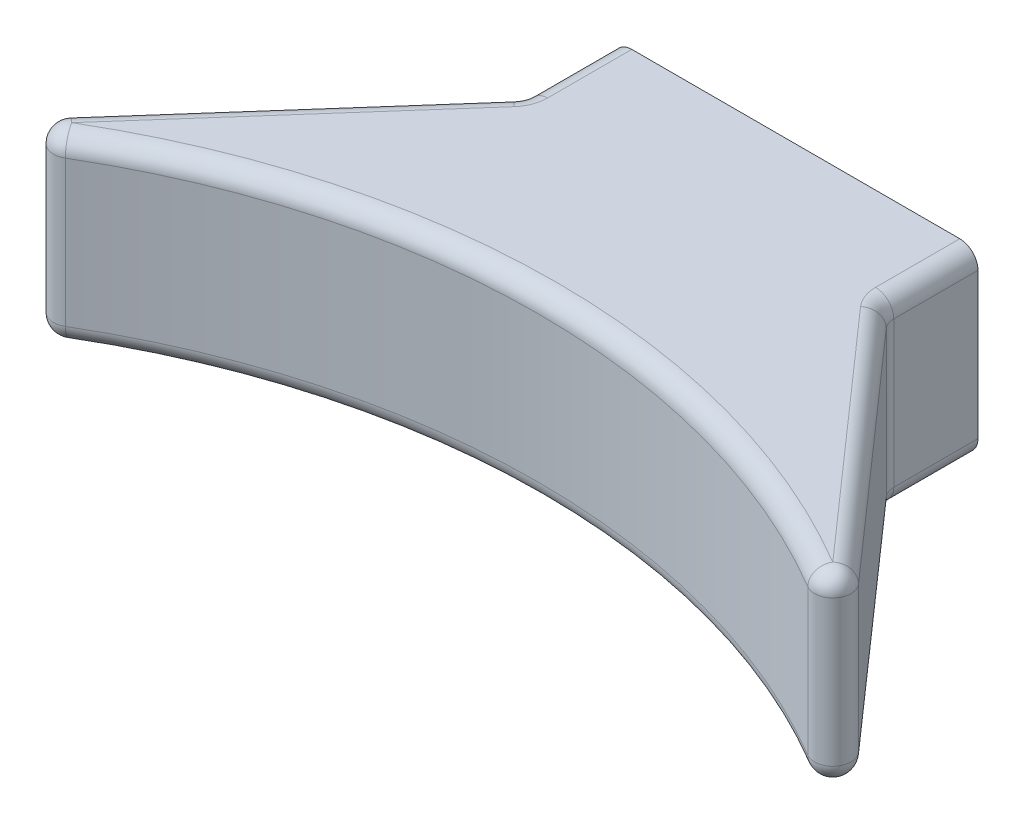
ISO-10303-21;
HEADER;
FILE_DESCRIPTION(('STEP AP214'),'2;1');
FILE_NAME('part.step','',(''),(''),'','','');
FILE_SCHEMA(('AUTOMOTIVE_DESIGN { 1 0 10303 214 1 1 1 1 }'));
ENDSEC;
DATA;
#1=APPLICATION_CONTEXT('core data for automotive mechanical design processes');
#2=APPLICATION_PROTOCOL_DEFINITION('international standard','automotive_design',2000,#1);
#3=PRODUCT_CONTEXT('',#1,'mechanical');
#4=PRODUCT('Part','Part','',(#3));
#5=PRODUCT_RELATED_PRODUCT_CATEGORY('part','',(#4));
#6=PRODUCT_DEFINITION_FORMATION('','',#4);
#7=PRODUCT_DEFINITION_CONTEXT('part definition',#1,'design');
#8=PRODUCT_DEFINITION('design','',#6,#7);
#9=PRODUCT_DEFINITION_SHAPE('','',#8);
#10=(LENGTH_UNIT() NAMED_UNIT(*) SI_UNIT(.MILLI.,.METRE.));
#11=(NAMED_UNIT(*) PLANE_ANGLE_UNIT() SI_UNIT($,.RADIAN.));
#12=(NAMED_UNIT(*) SI_UNIT($,.STERADIAN.) SOLID_ANGLE_UNIT());
#13=UNCERTAINTY_MEASURE_WITH_UNIT(LENGTH_MEASURE(1.E-05),#10,'distance_accuracy_value','');
#14=(GEOMETRIC_REPRESENTATION_CONTEXT(3) GLOBAL_UNCERTAINTY_ASSIGNED_CONTEXT((#13)) GLOBAL_UNIT_ASSIGNED_CONTEXT((#10,
#11,#12)) REPRESENTATION_CONTEXT('',''));
#15=CARTESIAN_POINT('',(0.,0.,0.));
#16=DIRECTION('',(0.,0.,1.));
#17=DIRECTION('',(1.,0.,0.));
#18=AXIS2_PLACEMENT_3D('',#15,#16,#17);
#19=CARTESIAN_POINT('',(12.7,6.35,6.35));
#20=DIRECTION('',(-1.,0.,0.));
#21=DIRECTION('',(0.,-1.,0.));
#22=AXIS2_PLACEMENT_3D('',#19,#20,#21);
#23=PLANE('',#22);
#24=DIRECTION('',(0.,1.,0.));
#25=VECTOR('',#24,1.);
#26=CARTESIAN_POINT('',(12.7,6.35,0.));
#27=LINE('',#26,#25);
#28=CARTESIAN_POINT('',(12.7,-5.08,0.));
#29=VERTEX_POINT('',#28);
#30=CARTESIAN_POINT('',(12.7,5.08,0.));
#31=VERTEX_POINT('',#30);
#32=EDGE_CURVE('E202',#29,#31,#27,.T.);
#33=ORIENTED_EDGE('',*,*,#32,.T.);
#34=DIRECTION('',(0.,0.,-1.));
#35=VECTOR('',#34,1.);
#36=CARTESIAN_POINT('',(12.7,5.08,6.35));
#37=LINE('',#36,#35);
#38=CARTESIAN_POINT('',(12.7,5.08,5.86998511927828));
#39=VERTEX_POINT('',#38);
#40=EDGE_CURVE('E267',#31,#39,#37,.F.);
#41=ORIENTED_EDGE('',*,*,#40,.T.);
#42=DIRECTION('',(0.,1.,0.));
#43=VECTOR('',#42,1.);
#44=CARTESIAN_POINT('',(12.7,6.35,5.86998511927828));
#45=LINE('',#44,#43);
#46=CARTESIAN_POINT('',(12.7,-5.08,5.86998511927828));
#47=VERTEX_POINT('',#46);
#48=EDGE_CURVE('E261',#39,#47,#45,.F.);
#49=ORIENTED_EDGE('',*,*,#48,.T.);
#50=DIRECTION('',(0.,0.,-1.));
#51=VECTOR('',#50,1.);
#52=CARTESIAN_POINT('',(12.7,-5.08,6.35));
#53=LINE('',#52,#51);
#54=EDGE_CURVE('E264',#47,#29,#53,.T.);
#55=ORIENTED_EDGE('',*,*,#54,.T.);
#56=EDGE_LOOP('',(#33,#41,#49,#55));
#57=FACE_BOUND('',#56,.T.);
#58=ADVANCED_FACE('F38',(#57),#23,.F.);
#59=CARTESIAN_POINT('',(-12.7,6.35,6.35));
#60=DIRECTION('',(0.,-1.,0.));
#61=DIRECTION('',(0.,0.,-1.));
#62=AXIS2_PLACEMENT_3D('',#59,#60,#61);
#63=PLANE('',#62);
#64=CARTESIAN_POINT('',(13.97,6.35,5.86998511927828));
#65=DIRECTION('',(0.,-1.,0.));
#66=DIRECTION('',(0.,0.,-1.));
#67=AXIS2_PLACEMENT_3D('',#64,#65,#66);
#68=CIRCLE('',#67,2.54);
#69=CARTESIAN_POINT('',(11.43,6.35,5.86998511927828));
#70=VERTEX_POINT('',#69);
#71=CARTESIAN_POINT('',(12.065,6.35,7.55003720180429));
#72=VERTEX_POINT('',#71);
#73=EDGE_CURVE('E231',#70,#72,#68,.F.);
#74=ORIENTED_EDGE('',*,*,#73,.F.);
#75=DIRECTION('',(0.,0.,-1.));
#76=VECTOR('',#75,1.);
#77=CARTESIAN_POINT('',(11.43,6.35,6.35));
#78=LINE('',#77,#76);
#79=CARTESIAN_POINT('',(11.43,6.35,0.));
#80=VERTEX_POINT('',#79);
#81=EDGE_CURVE('E235',#70,#80,#78,.T.);
#82=ORIENTED_EDGE('',*,*,#81,.T.);
#83=DIRECTION('',(-1.,0.,0.));
#84=VECTOR('',#83,1.);
#85=CARTESIAN_POINT('',(-12.7,6.35,0.));
#86=LINE('',#85,#84);
#87=CARTESIAN_POINT('',(-11.43,6.35,0.));
#88=VERTEX_POINT('',#87);
#89=EDGE_CURVE('E196',#80,#88,#86,.T.);
#90=ORIENTED_EDGE('',*,*,#89,.T.);
#91=DIRECTION('',(0.,0.,-1.));
#92=VECTOR('',#91,1.);
#93=CARTESIAN_POINT('',(-11.43,6.35,6.35));
#94=LINE('',#93,#92);
#95=CARTESIAN_POINT('',(-11.43,6.35,5.86998511927828));
#96=VERTEX_POINT('',#95);
#97=EDGE_CURVE('E170',#88,#96,#94,.F.);
#98=ORIENTED_EDGE('',*,*,#97,.T.);
#99=CARTESIAN_POINT('',(-13.97,6.35,5.86998511927828));
#100=DIRECTION('',(0.,-1.,0.));
#101=DIRECTION('',(0.,0.,-1.));
#102=AXIS2_PLACEMENT_3D('',#99,#100,#101);
#103=CIRCLE('',#102,2.54);
#104=CARTESIAN_POINT('',(-12.065,6.35,7.5500372018043));
#105=VERTEX_POINT('',#104);
#106=EDGE_CURVE('E225',#105,#96,#103,.F.);
#107=ORIENTED_EDGE('',*,*,#106,.F.);
#108=DIRECTION('',(0.661437827766148,0.,-0.75));
#109=VECTOR('',#108,1.);
#110=CARTESIAN_POINT('',(-26.5219176630172,6.35,23.9426409993245));
#111=LINE('',#110,#109);
#112=CARTESIAN_POINT('',(-26.5219176630172,6.35,23.9426409993246));
#113=VERTEX_POINT('',#112);
#114=EDGE_CURVE('E222',#105,#113,#111,.F.);
#115=ORIENTED_EDGE('',*,*,#114,.T.);
#116=CARTESIAN_POINT('',(0.,6.35,68.7519344938234));
#117=DIRECTION('',(0.,-1.,0.));
#118=DIRECTION('',(0.,0.,-1.));
#119=AXIS2_PLACEMENT_3D('',#116,#117,#118);
#120=CIRCLE('',#119,52.07);
#121=CARTESIAN_POINT('',(26.5219176630172,6.35,23.9426409993246));
#122=VERTEX_POINT('',#121);
#123=EDGE_CURVE('E176',#113,#122,#120,.T.);
#124=ORIENTED_EDGE('',*,*,#123,.T.);
#125=DIRECTION('',(0.661437827766148,0.,0.75));
#126=VECTOR('',#125,1.);
#127=CARTESIAN_POINT('',(11.7475,6.35,7.190026041263));
#128=LINE('',#127,#126);
#129=EDGE_CURVE('E219',#122,#72,#128,.F.);
#130=ORIENTED_EDGE('',*,*,#129,.T.);
#131=EDGE_LOOP('',(#74,#82,#90,#98,#107,#115,#124,#130));
#132=FACE_BOUND('',#131,.T.);
#133=ADVANCED_FACE('F453',(#132),#63,.F.);
#134=CARTESIAN_POINT('',(-12.7,6.35,6.35));
#135=DIRECTION('',(1.,0.,0.));
#136=DIRECTION('',(0.,1.,0.));
#137=AXIS2_PLACEMENT_3D('',#134,#135,#136);
#138=PLANE('',#137);
#139=DIRECTION('',(0.,-1.,0.));
#140=VECTOR('',#139,1.);
#141=CARTESIAN_POINT('',(-12.7,6.35,5.86998511927828));
#142=LINE('',#141,#140);
#143=CARTESIAN_POINT('',(-12.7,-5.08,5.86998511927828));
#144=VERTEX_POINT('',#143);
#145=CARTESIAN_POINT('',(-12.7,5.08,5.86998511927828));
#146=VERTEX_POINT('',#145);
#147=EDGE_CURVE('E185',#144,#146,#142,.F.);
#148=ORIENTED_EDGE('',*,*,#147,.T.);
#149=DIRECTION('',(0.,0.,-1.));
#150=VECTOR('',#149,1.);
#151=CARTESIAN_POINT('',(-12.7,5.08,6.35));
#152=LINE('',#151,#150);
#153=CARTESIAN_POINT('',(-12.7,5.08,0.));
#154=VERTEX_POINT('',#153);
#155=EDGE_CURVE('E169',#146,#154,#152,.T.);
#156=ORIENTED_EDGE('',*,*,#155,.T.);
#157=DIRECTION('',(0.,-1.,0.));
#158=VECTOR('',#157,1.);
#159=CARTESIAN_POINT('',(-12.7,6.35,0.));
#160=LINE('',#159,#158);
#161=CARTESIAN_POINT('',(-12.7,-5.08,0.));
#162=VERTEX_POINT('',#161);
#163=EDGE_CURVE('E182',#154,#162,#160,.T.);
#164=ORIENTED_EDGE('',*,*,#163,.T.);
#165=DIRECTION('',(0.,0.,-1.));
#166=VECTOR('',#165,1.);
#167=CARTESIAN_POINT('',(-12.7,-5.08,6.35));
#168=LINE('',#167,#166);
#169=EDGE_CURVE('E189',#162,#144,#168,.F.);
#170=ORIENTED_EDGE('',*,*,#169,.T.);
#171=EDGE_LOOP('',(#148,#156,#164,#170));
#172=FACE_BOUND('',#171,.T.);
#173=ADVANCED_FACE('F181',(#172),#138,.F.);
#174=CARTESIAN_POINT('',(-12.7,-6.35,6.35));
#175=DIRECTION('',(0.,1.,0.));
#176=DIRECTION('',(0.,0.,1.));
#177=AXIS2_PLACEMENT_3D('',#174,#175,#176);
#178=PLANE('',#177);
#179=CARTESIAN_POINT('',(-13.97,-6.35,5.86998511927828));
#180=DIRECTION('',(0.,1.,0.));
#181=DIRECTION('',(0.,0.,1.));
#182=AXIS2_PLACEMENT_3D('',#179,#180,#181);
#183=CIRCLE('',#182,2.54);
#184=CARTESIAN_POINT('',(-11.43,-6.35,5.86998511927828));
#185=VERTEX_POINT('',#184);
#186=CARTESIAN_POINT('',(-12.065,-6.35,7.5500372018043));
#187=VERTEX_POINT('',#186);
#188=EDGE_CURVE('E254',#185,#187,#183,.F.);
#189=ORIENTED_EDGE('',*,*,#188,.F.);
#190=DIRECTION('',(0.,0.,-1.));
#191=VECTOR('',#190,1.);
#192=CARTESIAN_POINT('',(-11.43,-6.35,6.35));
#193=LINE('',#192,#191);
#194=CARTESIAN_POINT('',(-11.43,-6.35,0.));
#195=VERTEX_POINT('',#194);
#196=EDGE_CURVE('E258',#185,#195,#193,.T.);
#197=ORIENTED_EDGE('',*,*,#196,.T.);
#198=DIRECTION('',(1.,0.,0.));
#199=VECTOR('',#198,1.);
#200=CARTESIAN_POINT('',(-12.7,-6.35,0.));
#201=LINE('',#200,#199);
#202=CARTESIAN_POINT('',(11.43,-6.35,0.));
#203=VERTEX_POINT('',#202);
#204=EDGE_CURVE('E195',#195,#203,#201,.T.);
#205=ORIENTED_EDGE('',*,*,#204,.T.);
#206=DIRECTION('',(0.,0.,-1.));
#207=VECTOR('',#206,1.);
#208=CARTESIAN_POINT('',(11.43,-6.35,6.35));
#209=LINE('',#208,#207);
#210=CARTESIAN_POINT('',(11.43,-6.35,5.86998511927828));
#211=VERTEX_POINT('',#210);
#212=EDGE_CURVE('E251',#203,#211,#209,.F.);
#213=ORIENTED_EDGE('',*,*,#212,.T.);
#214=CARTESIAN_POINT('',(13.97,-6.35,5.86998511927828));
#215=DIRECTION('',(0.,1.,0.));
#216=DIRECTION('',(0.,0.,1.));
#217=AXIS2_PLACEMENT_3D('',#214,#215,#216);
#218=CIRCLE('',#217,2.54);
#219=CARTESIAN_POINT('',(12.065,-6.35,7.5500372018043));
#220=VERTEX_POINT('',#219);
#221=EDGE_CURVE('E247',#220,#211,#218,.F.);
#222=ORIENTED_EDGE('',*,*,#221,.F.);
#223=DIRECTION('',(0.661437827766148,0.,0.75));
#224=VECTOR('',#223,1.);
#225=CARTESIAN_POINT('',(26.5219176630172,-6.35,23.9426409993246));
#226=LINE('',#225,#224);
#227=CARTESIAN_POINT('',(26.5219176630172,-6.35,23.9426409993246));
#228=VERTEX_POINT('',#227);
#229=EDGE_CURVE('E241',#220,#228,#226,.T.);
#230=ORIENTED_EDGE('',*,*,#229,.T.);
#231=CARTESIAN_POINT('',(0.,-6.35,68.7519344938234));
#232=DIRECTION('',(0.,1.,0.));
#233=DIRECTION('',(0.,0.,1.));
#234=AXIS2_PLACEMENT_3D('',#231,#232,#233);
#235=CIRCLE('',#234,52.07);
#236=CARTESIAN_POINT('',(-26.5219176630172,-6.35,23.9426409993246));
#237=VERTEX_POINT('',#236);
#238=EDGE_CURVE('E238',#228,#237,#235,.T.);
#239=ORIENTED_EDGE('',*,*,#238,.T.);
#240=DIRECTION('',(0.661437827766148,0.,-0.75));
#241=VECTOR('',#240,1.);
#242=CARTESIAN_POINT('',(-11.7475,-6.35,7.19002604126301));
#243=LINE('',#242,#241);
#244=EDGE_CURVE('E244',#237,#187,#243,.T.);
#245=ORIENTED_EDGE('',*,*,#244,.T.);
#246=EDGE_LOOP('',(#189,#197,#205,#213,#222,#230,#239,#245));
#247=FACE_BOUND('',#246,.T.);
#248=ADVANCED_FACE('F434',(#247),#178,.F.);
#249=CARTESIAN_POINT('',(0.,0.,0.));
#250=DIRECTION('',(0.,0.,1.));
#251=DIRECTION('',(1.,0.,0.));
#252=AXIS2_PLACEMENT_3D('',#249,#250,#251);
#253=PLANE('',#252);
#254=CARTESIAN_POINT('',(6.35,0.,0.));
#255=DIRECTION('',(0.,0.,-1.));
#256=DIRECTION('',(-1.,0.,0.));
#257=AXIS2_PLACEMENT_3D('',#254,#255,#256);
#258=CIRCLE('',#257,1.5);
#259=CARTESIAN_POINT('',(4.85,0.,0.));
#260=VERTEX_POINT('',#259);
#261=EDGE_CURVE('E414',#260,#260,#258,.T.);
#262=ORIENTED_EDGE('',*,*,#261,.F.);
#263=EDGE_LOOP('',(#262));
#264=FACE_BOUND('',#263,.T.);
#265=CARTESIAN_POINT('',(-6.35,0.,0.));
#266=DIRECTION('',(0.,0.,-1.));
#267=DIRECTION('',(-1.,0.,0.));
#268=AXIS2_PLACEMENT_3D('',#265,#266,#267);
#269=CIRCLE('',#268,1.5);
#270=CARTESIAN_POINT('',(-7.85,0.,0.));
#271=VERTEX_POINT('',#270);
#272=EDGE_CURVE('E406',#271,#271,#269,.T.);
#273=ORIENTED_EDGE('',*,*,#272,.F.);
#274=EDGE_LOOP('',(#273));
#275=FACE_BOUND('',#274,.T.);
#276=ORIENTED_EDGE('',*,*,#163,.F.);
#277=CARTESIAN_POINT('',(-11.43,5.08,0.));
#278=DIRECTION('',(0.,0.,1.));
#279=DIRECTION('',(1.,0.,0.));
#280=AXIS2_PLACEMENT_3D('',#277,#278,#279);
#281=CIRCLE('',#280,1.27);
#282=EDGE_CURVE('E165',#154,#88,#281,.F.);
#283=ORIENTED_EDGE('',*,*,#282,.T.);
#284=ORIENTED_EDGE('',*,*,#89,.F.);
#285=CARTESIAN_POINT('',(11.43,5.08,0.));
#286=DIRECTION('',(0.,0.,1.));
#287=DIRECTION('',(1.,0.,0.));
#288=AXIS2_PLACEMENT_3D('',#285,#286,#287);
#289=CIRCLE('',#288,1.27);
#290=EDGE_CURVE('E212',#80,#31,#289,.F.);
#291=ORIENTED_EDGE('',*,*,#290,.T.);
#292=ORIENTED_EDGE('',*,*,#32,.F.);
#293=CARTESIAN_POINT('',(11.43,-5.08,0.));
#294=DIRECTION('',(0.,0.,1.));
#295=DIRECTION('',(1.,0.,0.));
#296=AXIS2_PLACEMENT_3D('',#293,#294,#295);
#297=CIRCLE('',#296,1.27);
#298=EDGE_CURVE('E188',#29,#203,#297,.F.);
#299=ORIENTED_EDGE('',*,*,#298,.T.);
#300=ORIENTED_EDGE('',*,*,#204,.F.);
#301=CARTESIAN_POINT('',(-11.43,-5.08,0.));
#302=DIRECTION('',(0.,0.,1.));
#303=DIRECTION('',(1.,0.,0.));
#304=AXIS2_PLACEMENT_3D('',#301,#302,#303);
#305=CIRCLE('',#304,1.27);
#306=EDGE_CURVE('E177',#195,#162,#305,.F.);
#307=ORIENTED_EDGE('',*,*,#306,.T.);
#308=EDGE_LOOP('',(#276,#283,#284,#291,#292,#299,#300,#307));
#309=FACE_BOUND('',#308,.T.);
#310=ADVANCED_FACE('F191',(#264,#275,#309),#253,.F.);
#311=CARTESIAN_POINT('',(-12.7,6.35,6.35));
#312=DIRECTION('',(-0.75,0.,-0.661437827766148));
#313=DIRECTION('',(-0.661437827766148,0.,0.75));
#314=AXIS2_PLACEMENT_3D('',#311,#312,#313);
#315=PLANE('',#314);
#316=DIRECTION('',(0.,-1.,0.));
#317=VECTOR('',#316,1.);
#318=CARTESIAN_POINT('',(-27.4744176630172,6.35,23.1026149580615));
#319=LINE('',#318,#317);
#320=CARTESIAN_POINT('',(-27.4744176630172,5.08,23.1026149580615));
#321=VERTEX_POINT('',#320);
#322=CARTESIAN_POINT('',(-27.4744176630172,-5.08,23.1026149580615));
#323=VERTEX_POINT('',#322);
#324=EDGE_CURVE('E393',#321,#323,#319,.T.);
#325=ORIENTED_EDGE('',*,*,#324,.F.);
#326=DIRECTION('',(0.661437827766148,0.,-0.75));
#327=VECTOR('',#326,1.);
#328=CARTESIAN_POINT('',(-12.7,5.08,6.35));
#329=LINE('',#328,#327);
#330=CARTESIAN_POINT('',(-13.0175,5.08,6.71001116054129));
#331=VERTEX_POINT('',#330);
#332=EDGE_CURVE('E283',#321,#331,#329,.T.);
#333=ORIENTED_EDGE('',*,*,#332,.T.);
#334=DIRECTION('',(0.,-1.,0.));
#335=VECTOR('',#334,1.);
#336=CARTESIAN_POINT('',(-13.0175,6.35,6.71001116054129));
#337=LINE('',#336,#335);
#338=CARTESIAN_POINT('',(-13.0175,-5.08,6.71001116054129));
#339=VERTEX_POINT('',#338);
#340=EDGE_CURVE('E277',#331,#339,#337,.T.);
#341=ORIENTED_EDGE('',*,*,#340,.T.);
#342=DIRECTION('',(0.661437827766148,0.,-0.75));
#343=VECTOR('',#342,1.);
#344=CARTESIAN_POINT('',(-27.4744176630172,-5.08,23.1026149580615));
#345=LINE('',#344,#343);
#346=EDGE_CURVE('E280',#339,#323,#345,.F.);
#347=ORIENTED_EDGE('',*,*,#346,.T.);
#348=EDGE_LOOP('',(#325,#333,#341,#347));
#349=FACE_BOUND('',#348,.T.);
#350=ADVANCED_FACE('F433',(#349),#315,.T.);
#351=CARTESIAN_POINT('',(-26.5219176630172,6.35,23.9426409993245));
#352=DIRECTION('',(0.,-1.,0.));
#353=DIRECTION('',(0.,0.,-1.));
#354=AXIS2_PLACEMENT_3D('',#351,#352,#353);
#355=CYLINDRICAL_SURFACE('',#354,1.27);
#356=DIRECTION('',(0.,-1.,0.));
#357=VECTOR('',#356,1.);
#358=CARTESIAN_POINT('',(-25.8750416224558,6.35,25.0355505967514));
#359=LINE('',#358,#357);
#360=CARTESIAN_POINT('',(-25.8750416224558,5.08,25.0355505967514));
#361=VERTEX_POINT('',#360);
#362=CARTESIAN_POINT('',(-25.8750416224558,-5.08,25.0355505967514));
#363=VERTEX_POINT('',#362);
#364=EDGE_CURVE('E388',#361,#363,#359,.T.);
#365=ORIENTED_EDGE('',*,*,#364,.F.);
#366=CARTESIAN_POINT('',(-26.5219176630172,5.08,23.9426409993245));
#367=DIRECTION('',(0.,-1.,0.));
#368=DIRECTION('',(0.,0.,-1.));
#369=AXIS2_PLACEMENT_3D('',#366,#367,#368);
#370=CIRCLE('',#369,1.27);
#371=EDGE_CURVE('E289',#361,#321,#370,.T.);
#372=ORIENTED_EDGE('',*,*,#371,.T.);
#373=ORIENTED_EDGE('',*,*,#324,.T.);
#374=CARTESIAN_POINT('',(-26.5219176630172,-5.08,23.9426409993245));
#375=DIRECTION('',(0.,-1.,0.));
#376=DIRECTION('',(0.,0.,-1.));
#377=AXIS2_PLACEMENT_3D('',#374,#375,#376);
#378=CIRCLE('',#377,1.27);
#379=EDGE_CURVE('E286',#323,#363,#378,.F.);
#380=ORIENTED_EDGE('',*,*,#379,.T.);
#381=EDGE_LOOP('',(#365,#372,#373,#380));
#382=FACE_BOUND('',#381,.T.);
#383=ADVANCED_FACE('F578',(#382),#355,.T.);
#384=CARTESIAN_POINT('',(0.,6.35,68.7519344938234));
#385=DIRECTION('',(0.,-1.,0.));
#386=DIRECTION('',(0.,0.,-1.));
#387=AXIS2_PLACEMENT_3D('',#384,#385,#386);
#388=CYLINDRICAL_SURFACE('',#387,50.8);
#389=DIRECTION('',(0.,-1.,0.));
#390=VECTOR('',#389,1.);
#391=CARTESIAN_POINT('',(25.8750416224559,6.35,25.0355505967514));
#392=LINE('',#391,#390);
#393=CARTESIAN_POINT('',(25.8750416224559,5.08,25.0355505967514));
#394=VERTEX_POINT('',#393);
#395=CARTESIAN_POINT('',(25.8750416224559,-5.08,25.0355505967514));
#396=VERTEX_POINT('',#395);
#397=EDGE_CURVE('E383',#394,#396,#392,.T.);
#398=ORIENTED_EDGE('',*,*,#397,.F.);
#399=CARTESIAN_POINT('',(0.,5.08,68.7519344938234));
#400=DIRECTION('',(0.,-1.,0.));
#401=DIRECTION('',(0.,0.,-1.));
#402=AXIS2_PLACEMENT_3D('',#399,#400,#401);
#403=CIRCLE('',#402,50.8);
#404=EDGE_CURVE('E11',#394,#361,#403,.F.);
#405=ORIENTED_EDGE('',*,*,#404,.T.);
#406=ORIENTED_EDGE('',*,*,#364,.T.);
#407=CARTESIAN_POINT('',(0.,-5.08,68.7519344938234));
#408=DIRECTION('',(0.,1.,0.));
#409=DIRECTION('',(0.,0.,1.));
#410=AXIS2_PLACEMENT_3D('',#407,#408,#409);
#411=CIRCLE('',#410,50.8);
#412=EDGE_CURVE('E48',#363,#396,#411,.F.);
#413=ORIENTED_EDGE('',*,*,#412,.T.);
#414=EDGE_LOOP('',(#398,#405,#406,#413));
#415=FACE_BOUND('',#414,.T.);
#416=ADVANCED_FACE('F577',(#415),#388,.F.);
#417=CARTESIAN_POINT('',(26.5219176630172,6.35,23.9426409993246));
#418=DIRECTION('',(0.,-1.,0.));
#419=DIRECTION('',(0.,0.,-1.));
#420=AXIS2_PLACEMENT_3D('',#417,#418,#419);
#421=CYLINDRICAL_SURFACE('',#420,1.27);
#422=DIRECTION('',(0.,-1.,0.));
#423=VECTOR('',#422,1.);
#424=CARTESIAN_POINT('',(27.4744176630172,6.35,23.1026149580616));
#425=LINE('',#424,#423);
#426=CARTESIAN_POINT('',(27.4744176630172,5.08,23.1026149580616));
#427=VERTEX_POINT('',#426);
#428=CARTESIAN_POINT('',(27.4744176630172,-5.08,23.1026149580616));
#429=VERTEX_POINT('',#428);
#430=EDGE_CURVE('E379',#427,#429,#425,.T.);
#431=ORIENTED_EDGE('',*,*,#430,.F.);
#432=CARTESIAN_POINT('',(26.5219176630172,5.08,23.9426409993246));
#433=DIRECTION('',(0.,-1.,0.));
#434=DIRECTION('',(0.,0.,-1.));
#435=AXIS2_PLACEMENT_3D('',#432,#433,#434);
#436=CIRCLE('',#435,1.27);
#437=EDGE_CURVE('E273',#427,#394,#436,.T.);
#438=ORIENTED_EDGE('',*,*,#437,.T.);
#439=ORIENTED_EDGE('',*,*,#397,.T.);
#440=CARTESIAN_POINT('',(26.5219176630172,-5.08,23.9426409993246));
#441=DIRECTION('',(0.,-1.,0.));
#442=DIRECTION('',(0.,0.,-1.));
#443=AXIS2_PLACEMENT_3D('',#440,#441,#442);
#444=CIRCLE('',#443,1.27);
#445=EDGE_CURVE('E270',#396,#429,#444,.F.);
#446=ORIENTED_EDGE('',*,*,#445,.T.);
#447=EDGE_LOOP('',(#431,#438,#439,#446));
#448=FACE_BOUND('',#447,.T.);
#449=ADVANCED_FACE('F551',(#448),#421,.T.);
#450=CARTESIAN_POINT('',(27.4744176630172,6.35,23.1026149580616));
#451=DIRECTION('',(0.75,0.,-0.661437827766148));
#452=DIRECTION('',(-0.661437827766148,0.,-0.75));
#453=AXIS2_PLACEMENT_3D('',#450,#451,#452);
#454=PLANE('',#453);
#455=DIRECTION('',(0.,1.,0.));
#456=VECTOR('',#455,1.);
#457=CARTESIAN_POINT('',(13.0175,6.34999999999999,6.71001116054129));
#458=LINE('',#457,#456);
#459=CARTESIAN_POINT('',(13.0175,-5.08,6.71001116054129));
#460=VERTEX_POINT('',#459);
#461=CARTESIAN_POINT('',(13.0175,5.08,6.71001116054129));
#462=VERTEX_POINT('',#461);
#463=EDGE_CURVE('E56',#460,#462,#458,.T.);
#464=ORIENTED_EDGE('',*,*,#463,.T.);
#465=DIRECTION('',(0.661437827766148,0.,0.75));
#466=VECTOR('',#465,1.);
#467=CARTESIAN_POINT('',(27.4744176630172,5.08,23.1026149580616));
#468=LINE('',#467,#466);
#469=EDGE_CURVE('E296',#462,#427,#468,.T.);
#470=ORIENTED_EDGE('',*,*,#469,.T.);
#471=ORIENTED_EDGE('',*,*,#430,.T.);
#472=DIRECTION('',(0.661437827766148,0.,0.75));
#473=VECTOR('',#472,1.);
#474=CARTESIAN_POINT('',(12.7,-5.08,6.35));
#475=LINE('',#474,#473);
#476=EDGE_CURVE('E61',#429,#460,#475,.F.);
#477=ORIENTED_EDGE('',*,*,#476,.T.);
#478=EDGE_LOOP('',(#464,#470,#471,#477));
#479=FACE_BOUND('',#478,.T.);
#480=ADVANCED_FACE('F533',(#479),#454,.T.);
#481=CARTESIAN_POINT('',(11.43,-5.08,6.35));
#482=DIRECTION('',(0.,0.,-1.));
#483=DIRECTION('',(-1.,0.,0.));
#484=AXIS2_PLACEMENT_3D('',#481,#482,#483);
#485=CYLINDRICAL_SURFACE('',#484,1.27);
#486=CARTESIAN_POINT('',(11.43,-5.08,5.86998511927828));
#487=DIRECTION('',(0.,0.,1.));
#488=DIRECTION('',(1.,0.,0.));
#489=AXIS2_PLACEMENT_3D('',#486,#487,#488);
#490=CIRCLE('',#489,1.27);
#491=EDGE_CURVE('E42',#211,#47,#490,.T.);
#492=ORIENTED_EDGE('',*,*,#491,.F.);
#493=ORIENTED_EDGE('',*,*,#212,.F.);
#494=ORIENTED_EDGE('',*,*,#298,.F.);
#495=ORIENTED_EDGE('',*,*,#54,.F.);
#496=EDGE_LOOP('',(#492,#493,#494,#495));
#497=FACE_BOUND('',#496,.T.);
#498=ADVANCED_FACE('F40',(#497),#485,.T.);
#499=CARTESIAN_POINT('',(13.97,-5.08,5.86998511927828));
#500=DIRECTION('',(0.,1.,0.));
#501=DIRECTION('',(0.,0.,1.));
#502=AXIS2_PLACEMENT_3D('',#499,#500,#501);
#503=TOROIDAL_SURFACE('',#502,2.54,1.27);
#504=ORIENTED_EDGE('',*,*,#221,.T.);
#505=ORIENTED_EDGE('',*,*,#491,.T.);
#506=CARTESIAN_POINT('',(13.97,-5.08,5.86998511927828));
#507=DIRECTION('',(0.,1.,0.));
#508=DIRECTION('',(0.,0.,1.));
#509=AXIS2_PLACEMENT_3D('',#506,#507,#508);
#510=CIRCLE('',#509,1.27);
#511=EDGE_CURVE('E371',#460,#47,#510,.F.);
#512=ORIENTED_EDGE('',*,*,#511,.F.);
#513=CARTESIAN_POINT('',(12.065,-5.08,7.5500372018043));
#514=DIRECTION('',(-0.661437827766148,0.,-0.75));
#515=DIRECTION('',(-0.75,0.,0.661437827766148));
#516=AXIS2_PLACEMENT_3D('',#513,#514,#515);
#517=CIRCLE('',#516,1.27);
#518=EDGE_CURVE('E369',#220,#460,#517,.F.);
#519=ORIENTED_EDGE('',*,*,#518,.F.);
#520=EDGE_LOOP('',(#504,#505,#512,#519));
#521=FACE_BOUND('',#520,.T.);
#522=ADVANCED_FACE('F527',(#521),#503,.T.);
#523=CARTESIAN_POINT('',(11.43,5.08,6.35));
#524=DIRECTION('',(0.,0.,-1.));
#525=DIRECTION('',(-1.,0.,0.));
#526=AXIS2_PLACEMENT_3D('',#523,#524,#525);
#527=CYLINDRICAL_SURFACE('',#526,1.27);
#528=ORIENTED_EDGE('',*,*,#290,.F.);
#529=ORIENTED_EDGE('',*,*,#81,.F.);
#530=CARTESIAN_POINT('',(11.43,5.08,5.86998511927828));
#531=DIRECTION('',(0.,0.,1.));
#532=DIRECTION('',(1.,0.,0.));
#533=AXIS2_PLACEMENT_3D('',#530,#531,#532);
#534=CIRCLE('',#533,1.27);
#535=EDGE_CURVE('E365',#39,#70,#534,.T.);
#536=ORIENTED_EDGE('',*,*,#535,.F.);
#537=ORIENTED_EDGE('',*,*,#40,.F.);
#538=EDGE_LOOP('',(#528,#529,#536,#537));
#539=FACE_BOUND('',#538,.T.);
#540=ADVANCED_FACE('F525',(#539),#527,.T.);
#541=CARTESIAN_POINT('',(13.97,6.34999999999999,5.86998511927828));
#542=DIRECTION('',(0.,1.,0.));
#543=DIRECTION('',(0.,0.,1.));
#544=AXIS2_PLACEMENT_3D('',#541,#542,#543);
#545=CYLINDRICAL_SURFACE('',#544,1.27);
#546=ORIENTED_EDGE('',*,*,#511,.T.);
#547=ORIENTED_EDGE('',*,*,#48,.F.);
#548=CARTESIAN_POINT('',(13.97,5.08,5.86998511927828));
#549=DIRECTION('',(0.,-1.,0.));
#550=DIRECTION('',(0.,0.,-1.));
#551=AXIS2_PLACEMENT_3D('',#548,#549,#550);
#552=CIRCLE('',#551,1.27);
#553=EDGE_CURVE('E361',#462,#39,#552,.T.);
#554=ORIENTED_EDGE('',*,*,#553,.F.);
#555=ORIENTED_EDGE('',*,*,#463,.F.);
#556=EDGE_LOOP('',(#546,#547,#554,#555));
#557=FACE_BOUND('',#556,.T.);
#558=ADVANCED_FACE('F521',(#557),#545,.F.);
#559=CARTESIAN_POINT('',(0.63499999999999,-5.08,-5.41036457768211));
#560=DIRECTION('',(-0.661437827766148,0.,-0.75));
#561=DIRECTION('',(-0.75,0.,0.661437827766148));
#562=AXIS2_PLACEMENT_3D('',#559,#560,#561);
#563=CYLINDRICAL_SURFACE('',#562,1.27);
#564=ORIENTED_EDGE('',*,*,#518,.T.);
#565=ORIENTED_EDGE('',*,*,#476,.F.);
#566=CARTESIAN_POINT('',(26.5219176630172,-5.08,23.9426409993246));
#567=DIRECTION('',(0.661437827766148,0.,0.749999999999999));
#568=DIRECTION('',(0.749999999999999,0.,-0.661437827766148));
#569=AXIS2_PLACEMENT_3D('',#566,#567,#568);
#570=CIRCLE('',#569,1.27);
#571=EDGE_CURVE('E357',#228,#429,#570,.T.);
#572=ORIENTED_EDGE('',*,*,#571,.F.);
#573=ORIENTED_EDGE('',*,*,#229,.F.);
#574=EDGE_LOOP('',(#564,#565,#572,#573));
#575=FACE_BOUND('',#574,.T.);
#576=ADVANCED_FACE('F517',(#575),#563,.T.);
#577=CARTESIAN_POINT('',(13.97,5.08,5.86998511927828));
#578=DIRECTION('',(0.,-1.,0.));
#579=DIRECTION('',(0.,0.,-1.));
#580=AXIS2_PLACEMENT_3D('',#577,#578,#579);
#581=TOROIDAL_SURFACE('',#580,2.54,1.27);
#582=ORIENTED_EDGE('',*,*,#535,.T.);
#583=ORIENTED_EDGE('',*,*,#73,.T.);
#584=CARTESIAN_POINT('',(12.065,5.08,7.55003720180429));
#585=DIRECTION('',(-0.661437827766148,0.,-0.75));
#586=DIRECTION('',(-0.75,0.,0.661437827766148));
#587=AXIS2_PLACEMENT_3D('',#584,#585,#586);
#588=CIRCLE('',#587,1.27);
#589=EDGE_CURVE('E353',#462,#72,#588,.F.);
#590=ORIENTED_EDGE('',*,*,#589,.F.);
#591=ORIENTED_EDGE('',*,*,#553,.T.);
#592=EDGE_LOOP('',(#582,#583,#590,#591));
#593=FACE_BOUND('',#592,.T.);
#594=ADVANCED_FACE('F513',(#593),#581,.T.);
#595=CARTESIAN_POINT('',(26.5219176630172,-5.08,23.9426409993246));
#596=DIRECTION('',(0.,1.,0.));
#597=DIRECTION('',(0.,0.,1.));
#598=AXIS2_PLACEMENT_3D('',#595,#596,#597);
#599=SPHERICAL_SURFACE('',#598,1.27);
#600=ORIENTED_EDGE('',*,*,#571,.T.);
#601=ORIENTED_EDGE('',*,*,#445,.F.);
#602=CARTESIAN_POINT('',(26.5219176630172,-5.08,23.9426409993246));
#603=DIRECTION('',(-0.860558738131341,0.,-0.509351213040465));
#604=DIRECTION('',(-0.509351213040465,0.,0.860558738131341));
#605=AXIS2_PLACEMENT_3D('',#602,#603,#604);
#606=CIRCLE('',#605,1.27);
#607=EDGE_CURVE('E349',#228,#396,#606,.T.);
#608=ORIENTED_EDGE('',*,*,#607,.F.);
#609=EDGE_LOOP('',(#600,#601,#608));
#610=FACE_BOUND('',#609,.T.);
#611=ADVANCED_FACE('F509',(#610),#599,.T.);
#612=CARTESIAN_POINT('',(26.5219176630172,5.08,23.9426409993246));
#613=DIRECTION('',(-0.661437827766148,0.,-0.75));
#614=DIRECTION('',(-0.75,0.,0.661437827766148));
#615=AXIS2_PLACEMENT_3D('',#612,#613,#614);
#616=CYLINDRICAL_SURFACE('',#615,1.27);
#617=ORIENTED_EDGE('',*,*,#589,.T.);
#618=ORIENTED_EDGE('',*,*,#129,.F.);
#619=CARTESIAN_POINT('',(26.5219176630172,5.08,23.9426409993246));
#620=DIRECTION('',(0.661437827766148,0.,0.749999999999999));
#621=DIRECTION('',(0.749999999999999,0.,-0.661437827766148));
#622=AXIS2_PLACEMENT_3D('',#619,#620,#621);
#623=CIRCLE('',#622,1.27);
#624=EDGE_CURVE('E345',#427,#122,#623,.T.);
#625=ORIENTED_EDGE('',*,*,#624,.F.);
#626=ORIENTED_EDGE('',*,*,#469,.F.);
#627=EDGE_LOOP('',(#617,#618,#625,#626));
#628=FACE_BOUND('',#627,.T.);
#629=ADVANCED_FACE('F505',(#628),#616,.T.);
#630=CARTESIAN_POINT('',(0.,-5.08,68.7519344938234));
#631=DIRECTION('',(0.,1.,0.));
#632=DIRECTION('',(0.,0.,1.));
#633=AXIS2_PLACEMENT_3D('',#630,#631,#632);
#634=TOROIDAL_SURFACE('',#633,52.07,1.27);
#635=ORIENTED_EDGE('',*,*,#607,.T.);
#636=ORIENTED_EDGE('',*,*,#412,.F.);
#637=CARTESIAN_POINT('',(-26.5219176630172,-5.08,23.9426409993246));
#638=DIRECTION('',(-0.86055873813134,0.,0.509351213040468));
#639=DIRECTION('',(0.509351213040468,0.,0.86055873813134));
#640=AXIS2_PLACEMENT_3D('',#637,#638,#639);
#641=CIRCLE('',#640,1.27);
#642=EDGE_CURVE('E341',#237,#363,#641,.T.);
#643=ORIENTED_EDGE('',*,*,#642,.F.);
#644=ORIENTED_EDGE('',*,*,#238,.F.);
#645=EDGE_LOOP('',(#635,#636,#643,#644));
#646=FACE_BOUND('',#645,.T.);
#647=ADVANCED_FACE('F501',(#646),#634,.T.);
#648=CARTESIAN_POINT('',(26.5219176630172,5.08,23.9426409993246));
#649=DIRECTION('',(0.,-1.,0.));
#650=DIRECTION('',(0.,0.,-1.));
#651=AXIS2_PLACEMENT_3D('',#648,#649,#650);
#652=SPHERICAL_SURFACE('',#651,1.27);
#653=ORIENTED_EDGE('',*,*,#437,.F.);
#654=ORIENTED_EDGE('',*,*,#624,.T.);
#655=CARTESIAN_POINT('',(26.5219176630172,5.08,23.9426409993246));
#656=DIRECTION('',(-0.860558738131341,0.,-0.509351213040465));
#657=DIRECTION('',(-0.509351213040465,0.,0.860558738131341));
#658=AXIS2_PLACEMENT_3D('',#655,#656,#657);
#659=CIRCLE('',#658,1.27);
#660=EDGE_CURVE('E337',#394,#122,#659,.T.);
#661=ORIENTED_EDGE('',*,*,#660,.F.);
#662=EDGE_LOOP('',(#653,#654,#661));
#663=FACE_BOUND('',#662,.T.);
#664=ADVANCED_FACE('F497',(#663),#652,.T.);
#665=CARTESIAN_POINT('',(-26.5219176630172,-5.08,23.9426409993245));
#666=DIRECTION('',(0.,1.,0.));
#667=DIRECTION('',(0.,0.,1.));
#668=AXIS2_PLACEMENT_3D('',#665,#666,#667);
#669=SPHERICAL_SURFACE('',#668,1.27);
#670=ORIENTED_EDGE('',*,*,#642,.T.);
#671=ORIENTED_EDGE('',*,*,#379,.F.);
#672=CARTESIAN_POINT('',(-26.5219176630172,-5.08,23.9426409993245));
#673=DIRECTION('',(0.661437827766147,0.,-0.750000000000001));
#674=DIRECTION('',(-0.750000000000001,0.,-0.661437827766147));
#675=AXIS2_PLACEMENT_3D('',#672,#673,#674);
#676=CIRCLE('',#675,1.27);
#677=EDGE_CURVE('E333',#237,#323,#676,.T.);
#678=ORIENTED_EDGE('',*,*,#677,.F.);
#679=EDGE_LOOP('',(#670,#671,#678));
#680=FACE_BOUND('',#679,.T.);
#681=ADVANCED_FACE('F493',(#680),#669,.T.);
#682=CARTESIAN_POINT('',(0.,5.08,68.7519344938234));
#683=DIRECTION('',(0.,-1.,0.));
#684=DIRECTION('',(0.,0.,-1.));
#685=AXIS2_PLACEMENT_3D('',#682,#683,#684);
#686=TOROIDAL_SURFACE('',#685,52.07,1.27);
#687=ORIENTED_EDGE('',*,*,#660,.T.);
#688=ORIENTED_EDGE('',*,*,#123,.F.);
#689=CARTESIAN_POINT('',(-26.5219176630172,5.08,23.9426409993246));
#690=DIRECTION('',(-0.860558738131339,0.,0.509351213040469));
#691=DIRECTION('',(0.509351213040469,0.,0.860558738131339));
#692=AXIS2_PLACEMENT_3D('',#689,#690,#691);
#693=CIRCLE('',#692,1.27);
#694=EDGE_CURVE('E329',#361,#113,#693,.T.);
#695=ORIENTED_EDGE('',*,*,#694,.F.);
#696=ORIENTED_EDGE('',*,*,#404,.F.);
#697=EDGE_LOOP('',(#687,#688,#695,#696));
#698=FACE_BOUND('',#697,.T.);
#699=ADVANCED_FACE('F489',(#698),#686,.T.);
#700=CARTESIAN_POINT('',(-11.7475,-5.08,7.19002604126301));
#701=DIRECTION('',(-0.661437827766148,0.,0.75));
#702=DIRECTION('',(0.75,0.,0.661437827766148));
#703=AXIS2_PLACEMENT_3D('',#700,#701,#702);
#704=CYLINDRICAL_SURFACE('',#703,1.27);
#705=ORIENTED_EDGE('',*,*,#677,.T.);
#706=ORIENTED_EDGE('',*,*,#346,.F.);
#707=CARTESIAN_POINT('',(-12.065,-5.08,7.5500372018043));
#708=DIRECTION('',(0.661437827766148,0.,-0.75));
#709=DIRECTION('',(-0.75,0.,-0.661437827766148));
#710=AXIS2_PLACEMENT_3D('',#707,#708,#709);
#711=CIRCLE('',#710,1.27);
#712=EDGE_CURVE('E325',#187,#339,#711,.T.);
#713=ORIENTED_EDGE('',*,*,#712,.F.);
#714=ORIENTED_EDGE('',*,*,#244,.F.);
#715=EDGE_LOOP('',(#705,#706,#713,#714));
#716=FACE_BOUND('',#715,.T.);
#717=ADVANCED_FACE('F485',(#716),#704,.T.);
#718=CARTESIAN_POINT('',(-11.43,-5.08,6.35));
#719=DIRECTION('',(0.,0.,-1.));
#720=DIRECTION('',(-1.,0.,0.));
#721=AXIS2_PLACEMENT_3D('',#718,#719,#720);
#722=CYLINDRICAL_SURFACE('',#721,1.27);
#723=ORIENTED_EDGE('',*,*,#306,.F.);
#724=ORIENTED_EDGE('',*,*,#196,.F.);
#725=CARTESIAN_POINT('',(-11.43,-5.08,5.86998511927828));
#726=DIRECTION('',(0.,0.,1.));
#727=DIRECTION('',(1.,0.,0.));
#728=AXIS2_PLACEMENT_3D('',#725,#726,#727);
#729=CIRCLE('',#728,1.27);
#730=EDGE_CURVE('E321',#144,#185,#729,.T.);
#731=ORIENTED_EDGE('',*,*,#730,.F.);
#732=ORIENTED_EDGE('',*,*,#169,.F.);
#733=EDGE_LOOP('',(#723,#724,#731,#732));
#734=FACE_BOUND('',#733,.T.);
#735=ADVANCED_FACE('F481',(#734),#722,.T.);
#736=CARTESIAN_POINT('',(-26.5219176630172,5.08,23.9426409993245));
#737=DIRECTION('',(0.,-1.,0.));
#738=DIRECTION('',(0.,0.,-1.));
#739=AXIS2_PLACEMENT_3D('',#736,#737,#738);
#740=SPHERICAL_SURFACE('',#739,1.27);
#741=ORIENTED_EDGE('',*,*,#371,.F.);
#742=ORIENTED_EDGE('',*,*,#694,.T.);
#743=CARTESIAN_POINT('',(-26.5219176630172,5.08,23.9426409993245));
#744=DIRECTION('',(0.661437827766147,0.,-0.750000000000001));
#745=DIRECTION('',(-0.750000000000001,0.,-0.661437827766147));
#746=AXIS2_PLACEMENT_3D('',#743,#744,#745);
#747=CIRCLE('',#746,1.27);
#748=EDGE_CURVE('E317',#321,#113,#747,.T.);
#749=ORIENTED_EDGE('',*,*,#748,.F.);
#750=EDGE_LOOP('',(#741,#742,#749));
#751=FACE_BOUND('',#750,.T.);
#752=ADVANCED_FACE('F477',(#751),#740,.T.);
#753=CARTESIAN_POINT('',(-13.97,-5.08,5.86998511927828));
#754=DIRECTION('',(0.,1.,0.));
#755=DIRECTION('',(0.,0.,1.));
#756=AXIS2_PLACEMENT_3D('',#753,#754,#755);
#757=TOROIDAL_SURFACE('',#756,2.54,1.27);
#758=ORIENTED_EDGE('',*,*,#188,.T.);
#759=ORIENTED_EDGE('',*,*,#712,.T.);
#760=CARTESIAN_POINT('',(-13.97,-5.08,5.86998511927828));
#761=DIRECTION('',(0.,1.,0.));
#762=DIRECTION('',(0.,0.,1.));
#763=AXIS2_PLACEMENT_3D('',#760,#761,#762);
#764=CIRCLE('',#763,1.27);
#765=EDGE_CURVE('E313',#144,#339,#764,.F.);
#766=ORIENTED_EDGE('',*,*,#765,.F.);
#767=ORIENTED_EDGE('',*,*,#730,.T.);
#768=EDGE_LOOP('',(#758,#759,#766,#767));
#769=FACE_BOUND('',#768,.T.);
#770=ADVANCED_FACE('F473',(#769),#757,.T.);
#771=CARTESIAN_POINT('',(-11.7475,5.08,7.19002604126301));
#772=DIRECTION('',(-0.661437827766148,0.,0.75));
#773=DIRECTION('',(0.75,0.,0.661437827766148));
#774=AXIS2_PLACEMENT_3D('',#771,#772,#773);
#775=CYLINDRICAL_SURFACE('',#774,1.27);
#776=ORIENTED_EDGE('',*,*,#748,.T.);
#777=ORIENTED_EDGE('',*,*,#114,.F.);
#778=CARTESIAN_POINT('',(-12.065,5.08,7.5500372018043));
#779=DIRECTION('',(0.661437827766148,0.,-0.75));
#780=DIRECTION('',(-0.75,0.,-0.661437827766148));
#781=AXIS2_PLACEMENT_3D('',#778,#779,#780);
#782=CIRCLE('',#781,1.27);
#783=EDGE_CURVE('E309',#331,#105,#782,.T.);
#784=ORIENTED_EDGE('',*,*,#783,.F.);
#785=ORIENTED_EDGE('',*,*,#332,.F.);
#786=EDGE_LOOP('',(#776,#777,#784,#785));
#787=FACE_BOUND('',#786,.T.);
#788=ADVANCED_FACE('F469',(#787),#775,.T.);
#789=CARTESIAN_POINT('',(-13.97,6.35,5.86998511927828));
#790=DIRECTION('',(0.,-1.,0.));
#791=DIRECTION('',(0.,0.,-1.));
#792=AXIS2_PLACEMENT_3D('',#789,#790,#791);
#793=CYLINDRICAL_SURFACE('',#792,1.27);
#794=ORIENTED_EDGE('',*,*,#765,.T.);
#795=ORIENTED_EDGE('',*,*,#340,.F.);
#796=CARTESIAN_POINT('',(-13.97,5.08,5.86998511927828));
#797=DIRECTION('',(0.,-1.,0.));
#798=DIRECTION('',(0.,0.,-1.));
#799=AXIS2_PLACEMENT_3D('',#796,#797,#798);
#800=CIRCLE('',#799,1.27);
#801=EDGE_CURVE('E304',#146,#331,#800,.T.);
#802=ORIENTED_EDGE('',*,*,#801,.F.);
#803=ORIENTED_EDGE('',*,*,#147,.F.);
#804=EDGE_LOOP('',(#794,#795,#802,#803));
#805=FACE_BOUND('',#804,.T.);
#806=ADVANCED_FACE('F465',(#805),#793,.F.);
#807=CARTESIAN_POINT('',(-13.97,5.08,5.86998511927828));
#808=DIRECTION('',(0.,-1.,0.));
#809=DIRECTION('',(0.,0.,-1.));
#810=AXIS2_PLACEMENT_3D('',#807,#808,#809);
#811=TOROIDAL_SURFACE('',#810,2.54,1.27);
#812=ORIENTED_EDGE('',*,*,#783,.T.);
#813=ORIENTED_EDGE('',*,*,#106,.T.);
#814=CARTESIAN_POINT('',(-11.43,5.08,5.86998511927828));
#815=DIRECTION('',(0.,0.,1.));
#816=DIRECTION('',(1.,0.,0.));
#817=AXIS2_PLACEMENT_3D('',#814,#815,#816);
#818=CIRCLE('',#817,1.27);
#819=EDGE_CURVE('E301',#146,#96,#818,.F.);
#820=ORIENTED_EDGE('',*,*,#819,.F.);
#821=ORIENTED_EDGE('',*,*,#801,.T.);
#822=EDGE_LOOP('',(#812,#813,#820,#821));
#823=FACE_BOUND('',#822,.T.);
#824=ADVANCED_FACE('F448',(#823),#811,.T.);
#825=CARTESIAN_POINT('',(-11.43,5.08,6.35));
#826=DIRECTION('',(0.,0.,-1.));
#827=DIRECTION('',(-1.,0.,0.));
#828=AXIS2_PLACEMENT_3D('',#825,#826,#827);
#829=CYLINDRICAL_SURFACE('',#828,1.27);
#830=ORIENTED_EDGE('',*,*,#819,.T.);
#831=ORIENTED_EDGE('',*,*,#97,.F.);
#832=ORIENTED_EDGE('',*,*,#282,.F.);
#833=ORIENTED_EDGE('',*,*,#155,.F.);
#834=EDGE_LOOP('',(#830,#831,#832,#833));
#835=FACE_BOUND('',#834,.T.);
#836=ADVANCED_FACE('F168',(#835),#829,.T.);
#837=CARTESIAN_POINT('',(-6.35,0.,9.525));
#838=DIRECTION('',(0.,0.,-1.));
#839=DIRECTION('',(-1.,0.,0.));
#840=AXIS2_PLACEMENT_3D('',#837,#838,#839);
#841=CYLINDRICAL_SURFACE('',#840,1.5);
#842=CARTESIAN_POINT('',(-6.35,0.,9.525));
#843=DIRECTION('',(0.,0.,-1.));
#844=DIRECTION('',(-1.,0.,0.));
#845=AXIS2_PLACEMENT_3D('',#842,#843,#844);
#846=CIRCLE('',#845,1.5);
#847=CARTESIAN_POINT('',(-7.85,0.,9.525));
#848=VERTEX_POINT('',#847);
#849=EDGE_CURVE('E410',#848,#848,#846,.T.);
#850=CARTESIAN_POINT('',(-7.85,0.,9.525));
#851=CARTESIAN_POINT('',(-7.85,0.,9.42578125));
#852=CARTESIAN_POINT('',(-7.85,0.,9.3265625));
#853=CARTESIAN_POINT('',(-7.85,0.,9.128125));
#854=CARTESIAN_POINT('',(-7.85,0.,9.02890625));
#855=CARTESIAN_POINT('',(-7.85,0.,8.83046875));
#856=CARTESIAN_POINT('',(-7.85,0.,8.73125));
#857=CARTESIAN_POINT('',(-7.85,0.,8.5328125));
#858=CARTESIAN_POINT('',(-7.85,0.,8.43359375));
#859=CARTESIAN_POINT('',(-7.85,0.,8.23515625));
#860=CARTESIAN_POINT('',(-7.85,0.,8.1359375));
#861=CARTESIAN_POINT('',(-7.85,0.,7.9375));
#862=CARTESIAN_POINT('',(-7.85,0.,7.83828125));
#863=CARTESIAN_POINT('',(-7.85,0.,7.63984375));
#864=CARTESIAN_POINT('',(-7.85,0.,7.540625));
#865=CARTESIAN_POINT('',(-7.85,0.,7.3421875));
#866=CARTESIAN_POINT('',(-7.85,0.,7.24296875));
#867=CARTESIAN_POINT('',(-7.85,0.,7.04453125));
#868=CARTESIAN_POINT('',(-7.85,0.,6.9453125));
#869=CARTESIAN_POINT('',(-7.85,0.,6.746875));
#870=CARTESIAN_POINT('',(-7.85,0.,6.64765625));
#871=CARTESIAN_POINT('',(-7.85,0.,6.44921875));
#872=CARTESIAN_POINT('',(-7.85,0.,6.35));
#873=CARTESIAN_POINT('',(-7.85,0.,6.1515625));
#874=CARTESIAN_POINT('',(-7.85,0.,6.05234375));
#875=CARTESIAN_POINT('',(-7.85,0.,5.85390625));
#876=CARTESIAN_POINT('',(-7.85,0.,5.7546875));
#877=CARTESIAN_POINT('',(-7.85,0.,5.55625));
#878=CARTESIAN_POINT('',(-7.85,0.,5.45703125));
#879=CARTESIAN_POINT('',(-7.85,0.,5.25859375));
#880=CARTESIAN_POINT('',(-7.85,0.,5.159375));
#881=CARTESIAN_POINT('',(-7.85,0.,4.9609375));
#882=CARTESIAN_POINT('',(-7.85,0.,4.86171875));
#883=CARTESIAN_POINT('',(-7.85,0.,4.66328125));
#884=CARTESIAN_POINT('',(-7.85,0.,4.5640625));
#885=CARTESIAN_POINT('',(-7.85,0.,4.365625));
#886=CARTESIAN_POINT('',(-7.85,0.,4.26640625));
#887=CARTESIAN_POINT('',(-7.85,0.,4.06796875));
#888=CARTESIAN_POINT('',(-7.85,0.,3.96875));
#889=CARTESIAN_POINT('',(-7.85,0.,3.7703125));
#890=CARTESIAN_POINT('',(-7.85,0.,3.67109375));
#891=CARTESIAN_POINT('',(-7.85,0.,3.47265625));
#892=CARTESIAN_POINT('',(-7.85,0.,3.3734375));
#893=CARTESIAN_POINT('',(-7.85,0.,3.175));
#894=CARTESIAN_POINT('',(-7.85,0.,3.07578125));
#895=CARTESIAN_POINT('',(-7.85,0.,2.87734375));
#896=CARTESIAN_POINT('',(-7.85,0.,2.778125));
#897=CARTESIAN_POINT('',(-7.85,0.,2.5796875));
#898=CARTESIAN_POINT('',(-7.85,0.,2.48046875));
#899=CARTESIAN_POINT('',(-7.85,0.,2.28203125));
#900=CARTESIAN_POINT('',(-7.85,0.,2.1828125));
#901=CARTESIAN_POINT('',(-7.85,0.,1.984375));
#902=CARTESIAN_POINT('',(-7.85,0.,1.88515625));
#903=CARTESIAN_POINT('',(-7.85,0.,1.68671875));
#904=CARTESIAN_POINT('',(-7.85,0.,1.5875));
#905=CARTESIAN_POINT('',(-7.85,0.,1.3890625));
#906=CARTESIAN_POINT('',(-7.85,0.,1.28984375));
#907=CARTESIAN_POINT('',(-7.85,0.,1.09140625));
#908=CARTESIAN_POINT('',(-7.85,0.,0.992187500000001));
#909=CARTESIAN_POINT('',(-7.85,0.,0.793750000000001));
#910=CARTESIAN_POINT('',(-7.85,0.,0.69453125));
#911=CARTESIAN_POINT('',(-7.85,0.,0.49609375));
#912=CARTESIAN_POINT('',(-7.85,0.,0.396875));
#913=CARTESIAN_POINT('',(-7.85,0.,0.1984375));
#914=CARTESIAN_POINT('',(-7.85,0.,0.0992187500000001));
#915=CARTESIAN_POINT('',(-7.85,0.,0.));
#916=B_SPLINE_CURVE_WITH_KNOTS('',3,(#850,#851,#852,#853,#854,#855,#856,#857,#858,#859,#860,
#861,#862,#863,#864,#865,#866,#867,#868,#869,#870,#871,#872,#873,#874,#875,#876,#877,#878,#879,
#880,#881,#882,#883,#884,#885,#886,#887,#888,#889,#890,#891,#892,#893,#894,#895,#896,#897,#898,
#899,#900,#901,#902,#903,#904,#905,#906,#907,#908,#909,#910,#911,#912,#913,#914,#915),
.UNSPECIFIED.,.F.,.F.,(4,2,2,2,2,2,2,2,2,2,2,2,2,2,2,2,2,2,2,2,2,2,2,2,2,2,2,2,2,2,2,2,4),(0.,
0.297656249999998,0.595312499999999,0.892968749999999,1.190625,1.48828125,1.7859375,2.08359375,
2.38125,2.67890625,2.9765625,3.27421875,3.571875,3.86953125,4.1671875,4.46484375,4.7625,
5.06015625,5.3578125,5.65546875,5.953125,6.25078125,6.5484375,6.84609375,7.14375,7.44140625,
7.7390625,8.03671875,8.334375,8.63203125,8.9296875,9.22734375,9.525),.UNSPECIFIED.);
#917=EDGE_CURVE('BSEAM438',#848,#271,#916,.T.);
#918=ORIENTED_EDGE('',*,*,#849,.F.);
#919=ORIENTED_EDGE('',*,*,#272,.T.);
#920=ORIENTED_EDGE('',*,*,#917,.T.);
#921=ORIENTED_EDGE('',*,*,#917,.F.);
#922=EDGE_LOOP('',(#918,#920,#919,#921));
#923=FACE_BOUND('',#922,.T.);
#924=ADVANCED_FACE('F438',(#923),#841,.F.);
#925=CARTESIAN_POINT('',(-6.35,0.,9.525));
#926=DIRECTION('',(0.,0.,-1.));
#927=DIRECTION('',(-1.,0.,0.));
#928=AXIS2_PLACEMENT_3D('',#925,#926,#927);
#929=PLANE('',#928);
#930=ORIENTED_EDGE('',*,*,#849,.T.);
#931=EDGE_LOOP('',(#930));
#932=FACE_BOUND('',#931,.T.);
#933=ADVANCED_FACE('F427',(#932),#929,.T.);
#934=CARTESIAN_POINT('',(6.35,0.,9.525));
#935=DIRECTION('',(0.,0.,-1.));
#936=DIRECTION('',(-1.,0.,0.));
#937=AXIS2_PLACEMENT_3D('',#934,#935,#936);
#938=CYLINDRICAL_SURFACE('',#937,1.5);
#939=CARTESIAN_POINT('',(6.35,0.,9.525));
#940=DIRECTION('',(0.,0.,-1.));
#941=DIRECTION('',(-1.,0.,0.));
#942=AXIS2_PLACEMENT_3D('',#939,#940,#941);
#943=CIRCLE('',#942,1.5);
#944=CARTESIAN_POINT('',(4.85,0.,9.525));
#945=VERTEX_POINT('',#944);
#946=EDGE_CURVE('E305',#945,#945,#943,.T.);
#947=CARTESIAN_POINT('',(4.85,0.,9.525));
#948=CARTESIAN_POINT('',(4.85,0.,9.42578125));
#949=CARTESIAN_POINT('',(4.85,0.,9.3265625));
#950=CARTESIAN_POINT('',(4.85,0.,9.128125));
#951=CARTESIAN_POINT('',(4.85,0.,9.02890625));
#952=CARTESIAN_POINT('',(4.85,0.,8.83046875));
#953=CARTESIAN_POINT('',(4.85,0.,8.73125));
#954=CARTESIAN_POINT('',(4.85,0.,8.5328125));
#955=CARTESIAN_POINT('',(4.85,0.,8.43359375));
#956=CARTESIAN_POINT('',(4.85,0.,8.23515625));
#957=CARTESIAN_POINT('',(4.85,0.,8.1359375));
#958=CARTESIAN_POINT('',(4.85,0.,7.9375));
#959=CARTESIAN_POINT('',(4.85,0.,7.83828125));
#960=CARTESIAN_POINT('',(4.85,0.,7.63984375));
#961=CARTESIAN_POINT('',(4.85,0.,7.540625));
#962=CARTESIAN_POINT('',(4.85,0.,7.3421875));
#963=CARTESIAN_POINT('',(4.85,0.,7.24296875));
#964=CARTESIAN_POINT('',(4.85,0.,7.04453125));
#965=CARTESIAN_POINT('',(4.85,0.,6.9453125));
#966=CARTESIAN_POINT('',(4.85,0.,6.746875));
#967=CARTESIAN_POINT('',(4.85,0.,6.64765625));
#968=CARTESIAN_POINT('',(4.85,0.,6.44921875));
#969=CARTESIAN_POINT('',(4.85,0.,6.35));
#970=CARTESIAN_POINT('',(4.85,0.,6.1515625));
#971=CARTESIAN_POINT('',(4.85,0.,6.05234375));
#972=CARTESIAN_POINT('',(4.85,0.,5.85390625));
#973=CARTESIAN_POINT('',(4.85,0.,5.7546875));
#974=CARTESIAN_POINT('',(4.85,0.,5.55625));
#975=CARTESIAN_POINT('',(4.85,0.,5.45703125));
#976=CARTESIAN_POINT('',(4.85,0.,5.25859375));
#977=CARTESIAN_POINT('',(4.85,0.,5.159375));
#978=CARTESIAN_POINT('',(4.85,0.,4.9609375));
#979=CARTESIAN_POINT('',(4.85,0.,4.86171875));
#980=CARTESIAN_POINT('',(4.85,0.,4.66328125));
#981=CARTESIAN_POINT('',(4.85,0.,4.5640625));
#982=CARTESIAN_POINT('',(4.85,0.,4.365625));
#983=CARTESIAN_POINT('',(4.85,0.,4.26640625));
#984=CARTESIAN_POINT('',(4.85,0.,4.06796875));
#985=CARTESIAN_POINT('',(4.85,0.,3.96875));
#986=CARTESIAN_POINT('',(4.85,0.,3.7703125));
#987=CARTESIAN_POINT('',(4.85,0.,3.67109375));
#988=CARTESIAN_POINT('',(4.85,0.,3.47265625));
#989=CARTESIAN_POINT('',(4.85,0.,3.3734375));
#990=CARTESIAN_POINT('',(4.85,0.,3.175));
#991=CARTESIAN_POINT('',(4.85,0.,3.07578125));
#992=CARTESIAN_POINT('',(4.85,0.,2.87734375));
#993=CARTESIAN_POINT('',(4.85,0.,2.778125));
#994=CARTESIAN_POINT('',(4.85,0.,2.5796875));
#995=CARTESIAN_POINT('',(4.85,0.,2.48046875));
#996=CARTESIAN_POINT('',(4.85,0.,2.28203125));
#997=CARTESIAN_POINT('',(4.85,0.,2.1828125));
#998=CARTESIAN_POINT('',(4.85,0.,1.984375));
#999=CARTESIAN_POINT('',(4.85,0.,1.88515625));
#1000=CARTESIAN_POINT('',(4.85,0.,1.68671875));
#1001=CARTESIAN_POINT('',(4.85,0.,1.5875));
#1002=CARTESIAN_POINT('',(4.85,0.,1.3890625));
#1003=CARTESIAN_POINT('',(4.85,0.,1.28984375));
#1004=CARTESIAN_POINT('',(4.85,0.,1.09140625));
#1005=CARTESIAN_POINT('',(4.85,0.,0.992187500000001));
#1006=CARTESIAN_POINT('',(4.85,0.,0.793750000000001));
#1007=CARTESIAN_POINT('',(4.85,0.,0.69453125));
#1008=CARTESIAN_POINT('',(4.85,0.,0.49609375));
#1009=CARTESIAN_POINT('',(4.85,0.,0.396875));
#1010=CARTESIAN_POINT('',(4.85,0.,0.1984375));
#1011=CARTESIAN_POINT('',(4.85,0.,0.0992187500000001));
#1012=CARTESIAN_POINT('',(4.85,0.,0.));
#1013=B_SPLINE_CURVE_WITH_KNOTS('',3,(#947,#948,#949,#950,#951,#952,#953,#954,#955,#956,#957,
#958,#959,#960,#961,#962,#963,#964,#965,#966,#967,#968,#969,#970,#971,#972,#973,#974,#975,#976,
#977,#978,#979,#980,#981,#982,#983,#984,#985,#986,#987,#988,#989,#990,#991,#992,#993,#994,#995,
#996,#997,#998,#999,#1000,#1001,#1002,#1003,#1004,#1005,#1006,#1007,#1008,#1009,#1010,#1011,
#1012),.UNSPECIFIED.,.F.,.F.,(4,2,2,2,2,2,2,2,2,2,2,2,2,2,2,2,2,2,2,2,2,2,2,2,2,2,2,2,2,2,2,2,
4),(0.,0.297656249999998,0.595312499999999,0.892968749999999,1.190625,1.48828125,1.7859375,
2.08359375,2.38125,2.67890625,2.9765625,3.27421875,3.571875,3.86953125,4.1671875,4.46484375,
4.7625,5.06015625,5.3578125,5.65546875,5.953125,6.25078125,6.5484375,6.84609375,7.14375,
7.44140625,7.7390625,8.03671875,8.334375,8.63203125,8.9296875,9.22734375,9.525),.UNSPECIFIED.);
#1014=EDGE_CURVE('BSEAM424',#945,#260,#1013,.T.);
#1015=ORIENTED_EDGE('',*,*,#946,.F.);
#1016=ORIENTED_EDGE('',*,*,#261,.T.);
#1017=ORIENTED_EDGE('',*,*,#1014,.T.);
#1018=ORIENTED_EDGE('',*,*,#1014,.F.);
#1019=EDGE_LOOP('',(#1015,#1017,#1016,#1018));
#1020=FACE_BOUND('',#1019,.T.);
#1021=ADVANCED_FACE('F424',(#1020),#938,.F.);
#1022=CARTESIAN_POINT('',(6.35,0.,9.525));
#1023=DIRECTION('',(0.,0.,-1.));
#1024=DIRECTION('',(-1.,0.,0.));
#1025=AXIS2_PLACEMENT_3D('',#1022,#1023,#1024);
#1026=PLANE('',#1025);
#1027=ORIENTED_EDGE('',*,*,#946,.T.);
#1028=EDGE_LOOP('',(#1027));
#1029=FACE_BOUND('',#1028,.T.);
#1030=ADVANCED_FACE('F422',(#1029),#1026,.T.);
#1031=CLOSED_SHELL('',(#58,#133,#173,#248,#310,#350,#383,#416,#449,#480,#498,#522,#540,#558,
#576,#594,#611,#629,#647,#664,#681,#699,#717,#735,#752,#770,#788,#806,#824,#836,#924,#933,#1021,#1030));
#1032=MANIFOLD_SOLID_BREP('B2',#1031);
#1033=ADVANCED_BREP_SHAPE_REPRESENTATION('',(#18,#1032),#14);
#1034=SHAPE_DEFINITION_REPRESENTATION(#9,#1033);
ENDSEC;
END-ISO-10303-21;
